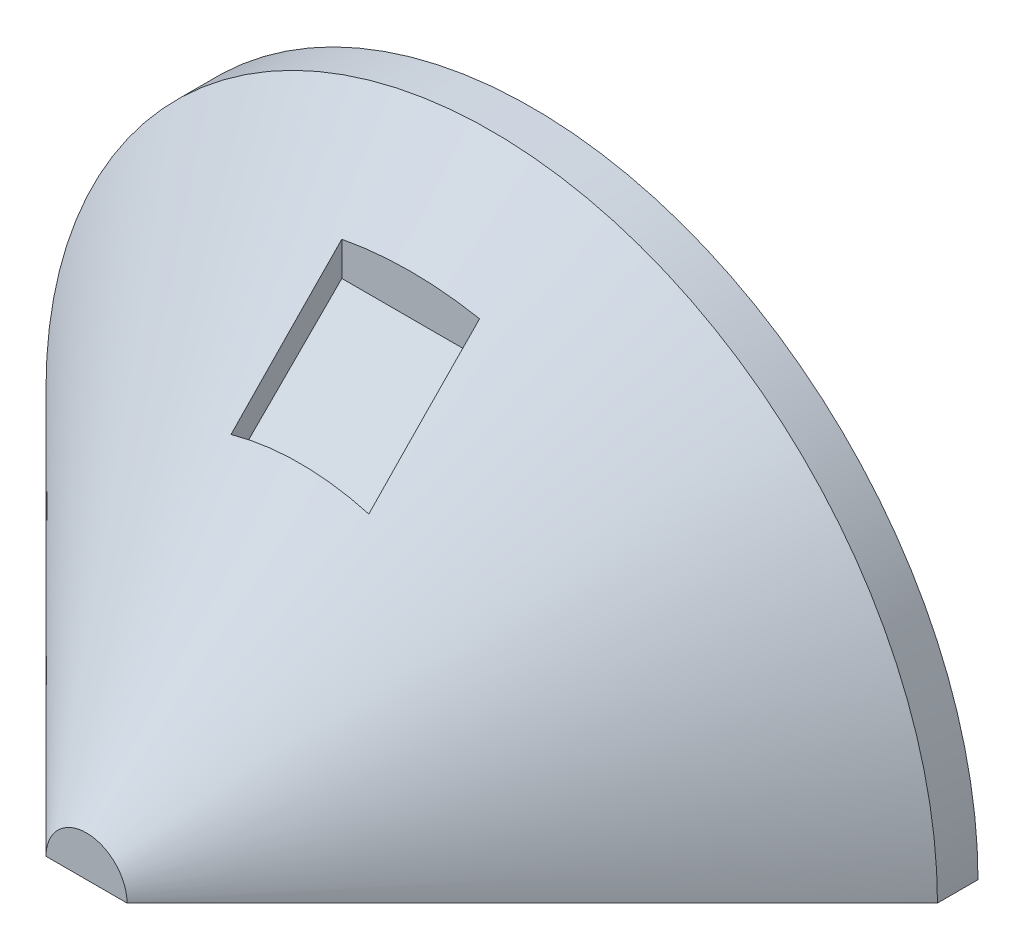
ISO-10303-21;
HEADER;
FILE_DESCRIPTION(('STEP AP214'),'2;1');
FILE_NAME('part.step','',(''),(''),'','','');
FILE_SCHEMA(('AUTOMOTIVE_DESIGN { 1 0 10303 214 1 1 1 1 }'));
ENDSEC;
DATA;
#1=APPLICATION_CONTEXT('core data for automotive mechanical design processes');
#2=APPLICATION_PROTOCOL_DEFINITION('international standard','automotive_design',2000,#1);
#3=PRODUCT_CONTEXT('',#1,'mechanical');
#4=PRODUCT('Part','Part','',(#3));
#5=PRODUCT_RELATED_PRODUCT_CATEGORY('part','',(#4));
#6=PRODUCT_DEFINITION_FORMATION('','',#4);
#7=PRODUCT_DEFINITION_CONTEXT('part definition',#1,'design');
#8=PRODUCT_DEFINITION('design','',#6,#7);
#9=PRODUCT_DEFINITION_SHAPE('','',#8);
#10=(LENGTH_UNIT() NAMED_UNIT(*) SI_UNIT(.MILLI.,.METRE.));
#11=(NAMED_UNIT(*) PLANE_ANGLE_UNIT() SI_UNIT($,.RADIAN.));
#12=(NAMED_UNIT(*) SI_UNIT($,.STERADIAN.) SOLID_ANGLE_UNIT());
#13=UNCERTAINTY_MEASURE_WITH_UNIT(LENGTH_MEASURE(1.E-05),#10,'distance_accuracy_value','');
#14=(GEOMETRIC_REPRESENTATION_CONTEXT(3) GLOBAL_UNCERTAINTY_ASSIGNED_CONTEXT((#13)) GLOBAL_UNIT_ASSIGNED_CONTEXT((#10,
#11,#12)) REPRESENTATION_CONTEXT('',''));
#15=CARTESIAN_POINT('',(0.,0.,0.));
#16=DIRECTION('',(0.,0.,1.));
#17=DIRECTION('',(1.,0.,0.));
#18=AXIS2_PLACEMENT_3D('',#15,#16,#17);
#19=CARTESIAN_POINT('',(0.,0.,0.));
#20=DIRECTION('',(0.,0.,1.));
#21=DIRECTION('',(1.,0.,0.));
#22=AXIS2_PLACEMENT_3D('',#19,#20,#21);
#23=PLANE('',#22);
#24=CARTESIAN_POINT('',(0.,0.,0.));
#25=DIRECTION('',(0.,0.,-1.));
#26=DIRECTION('',(-1.,0.,0.));
#27=AXIS2_PLACEMENT_3D('',#24,#25,#26);
#28=CIRCLE('',#27,3.81);
#29=CARTESIAN_POINT('',(-3.81,0.,0.));
#30=VERTEX_POINT('',#29);
#31=CARTESIAN_POINT('',(3.81,0.,0.));
#32=VERTEX_POINT('',#31);
#33=EDGE_CURVE('E70',#30,#32,#28,.T.);
#34=ORIENTED_EDGE('',*,*,#33,.F.);
#35=DIRECTION('',(1.,0.,0.));
#36=VECTOR('',#35,1.);
#37=CARTESIAN_POINT('',(0.,0.,0.));
#38=LINE('',#37,#36);
#39=EDGE_CURVE('E183',#30,#32,#38,.T.);
#40=ORIENTED_EDGE('',*,*,#39,.T.);
#41=EDGE_LOOP('',(#34,#40));
#42=FACE_BOUND('',#41,.T.);
#43=ADVANCED_FACE('F43',(#42),#23,.T.);
#44=CARTESIAN_POINT('',(0.,0.,-38.1));
#45=DIRECTION('',(0.,0.,-1.));
#46=DIRECTION('',(-1.,0.,0.));
#47=AXIS2_PLACEMENT_3D('',#44,#45,#46);
#48=CONICAL_SURFACE('',#47,41.91,0.785398163397448);
#49=CARTESIAN_POINT('',(6.477,0.842869448779956,-2.72161219820089));
#50=CARTESIAN_POINT('',(6.477,0.956219399993616,-2.73622982980979));
#51=CARTESIAN_POINT('',(6.477,1.06917219501972,-2.75371758379044));
#52=CARTESIAN_POINT('',(6.477,1.29406818146228,-2.79408485449339));
#53=CARTESIAN_POINT('',(6.477,1.40601174164106,-2.81696231149082));
#54=CARTESIAN_POINT('',(6.477,1.73945698590338,-2.89302240928253));
#55=CARTESIAN_POINT('',(6.477,1.95926530560957,-2.9537260118908));
#56=CARTESIAN_POINT('',(6.477,2.39011658919462,-3.09094491616291));
#57=CARTESIAN_POINT('',(6.477,2.60124188698637,-3.16720682383204));
#58=CARTESIAN_POINT('',(6.477,2.91393982876044,-3.29164978414877));
#59=CARTESIAN_POINT('',(6.477,3.01754390060147,-3.33482306888037));
#60=CARTESIAN_POINT('',(6.477,3.22343986921373,-3.42418922035148));
#61=CARTESIAN_POINT('',(6.477,3.325731790095,-3.47038203151352));
#62=CARTESIAN_POINT('',(6.477,3.62809203250162,-3.61179767215281));
#63=CARTESIAN_POINT('',(6.477,3.82633007166669,-3.71094460559741));
#64=CARTESIAN_POINT('',(6.477,4.21833739913427,-3.91775339505249));
#65=CARTESIAN_POINT('',(6.477,4.41210544276604,-4.02541758659637));
#66=CARTESIAN_POINT('',(6.477,4.7958407531647,-4.24773783100251));
#67=CARTESIAN_POINT('',(6.477,4.98580385774823,-4.36240103862235));
#68=CARTESIAN_POINT('',(6.477,5.36219902925257,-4.59732392131671));
#69=CARTESIAN_POINT('',(6.477,5.54863139945488,-4.71758311261388));
#70=CARTESIAN_POINT('',(6.477,5.91911464719325,-4.96314852254677));
#71=CARTESIAN_POINT('',(6.477,6.10315432980602,-5.08847158153622));
#72=CARTESIAN_POINT('',(6.477,6.46856250247429,-5.34295994379753));
#73=CARTESIAN_POINT('',(6.477,6.64993086410265,-5.47212543090337));
#74=CARTESIAN_POINT('',(6.477,7.19035996873437,-5.8642502768921));
#75=CARTESIAN_POINT('',(6.477,7.54595823019096,-6.13198169820763));
#76=CARTESIAN_POINT('',(6.477,8.25922989971028,-6.68352816740761));
#77=CARTESIAN_POINT('',(6.477,8.61671859071855,-6.9675801740641));
#78=CARTESIAN_POINT('',(6.477,9.32605648448804,-7.54269983750977));
#79=CARTESIAN_POINT('',(6.477,9.6779050632271,-7.8337682617965));
#80=CARTESIAN_POINT('',(6.477,10.3763131645805,-8.42043924893455));
#81=CARTESIAN_POINT('',(6.477,10.7228835707738,-8.71602889344435));
#82=CARTESIAN_POINT('',(6.477,11.4125166078571,-9.31123328104519));
#83=CARTESIAN_POINT('',(6.477,11.7555793995797,-9.61084783811346));
#84=CARTESIAN_POINT('',(6.477,12.4297304605082,-10.2051742796611));
#85=CARTESIAN_POINT('',(6.477,12.7608930365156,-10.4998019973915));
#86=CARTESIAN_POINT('',(6.477,13.4210382810889,-11.0914910845659));
#87=CARTESIAN_POINT('',(6.477,13.750020935978,-11.3885524692526));
#88=CARTESIAN_POINT('',(6.477,14.7342970223113,-12.2827126850865));
#89=CARTESIAN_POINT('',(6.477,15.3869006908484,-12.88277171935));
#90=CARTESIAN_POINT('',(6.477,16.6871225335786,-14.0883988575834));
#91=CARTESIAN_POINT('',(6.477,17.3347401316875,-14.6939675810111));
#92=CARTESIAN_POINT('',(6.477,18.6262602205971,-15.9090577091594));
#93=CARTESIAN_POINT('',(6.477,19.2701626910742,-16.5185791354645));
#94=CARTESIAN_POINT('',(6.477,20.5558959972302,-17.7412616804212));
#95=CARTESIAN_POINT('',(6.477,21.1977236416842,-18.3544261515724));
#96=CARTESIAN_POINT('',(6.477,22.4792116770366,-19.5830188474137));
#97=CARTESIAN_POINT('',(6.477,23.1188720604752,-20.1984470798805));
#98=CARTESIAN_POINT('',(6.477,24.3964409812457,-21.4310309819449));
#99=CARTESIAN_POINT('',(6.477,25.0343496355804,-22.0481865303223));
#100=CARTESIAN_POINT('',(6.477,26.3087958082669,-23.2839116346047));
#101=CARTESIAN_POINT('',(6.477,26.9453333261877,-23.9024811909542));
#102=CARTESIAN_POINT('',(6.477,28.8356768546421,-25.7427504309353));
#103=CARTESIAN_POINT('',(6.477,30.0878846268268,-26.9660916895148));
#104=CARTESIAN_POINT('',(6.477,32.5893641796665,-29.4158116724794));
#105=CARTESIAN_POINT('',(6.477,33.8386359105584,-30.642190447634));
#106=CARTESIAN_POINT('',(6.477,36.3345983976939,-33.0966837674544));
#107=CARTESIAN_POINT('',(6.477,37.5812899140691,-34.3247975393266));
#108=CARTESIAN_POINT('',(6.477,40.0730812954313,-36.7826276944647));
#109=CARTESIAN_POINT('',(6.477,41.3181811671586,-38.0123440708989));
#110=CARTESIAN_POINT('',(6.477,43.4405197959329,-40.1105296729186));
#111=CARTESIAN_POINT('',(6.477,44.3180634869518,-40.9786905180742));
#112=CARTESIAN_POINT('',(6.477,46.0727068234096,-42.7155880657633));
#113=CARTESIAN_POINT('',(6.477,46.9498064320186,-43.5843248055021));
#114=CARTESIAN_POINT('',(6.477,48.709286945283,-45.3278887862616));
#115=CARTESIAN_POINT('',(6.477,49.5916650507695,-46.2027188517798));
#116=CARTESIAN_POINT('',(6.477,51.355984011298,-47.9526905904317));
#117=CARTESIAN_POINT('',(6.477,52.2379248936328,-48.8278322360483));
#118=CARTESIAN_POINT('',(6.477,53.1197102062117,-49.70313055122));
#119=B_SPLINE_CURVE_WITH_KNOTS('',3,(#49,#50,#51,#52,#53,#54,#55,#56,#57,#58,#59,#60,#61,#62,
#63,#64,#65,#66,#67,#68,#69,#70,#71,#72,#73,#74,#75,#76,#77,#78,#79,#80,#81,#82,#83,#84,#85,#86,
#87,#88,#89,#90,#91,#92,#93,#94,#95,#96,#97,#98,#99,#100,#101,#102,#103,#104,#105,#106,#107,
#108,#109,#110,#111,#112,#113,#114,#115,#116,#117,#118),.UNSPECIFIED.,.F.,.F.,(4,2,2,2,2,2,2,2,
2,2,2,2,2,2,2,2,2,2,2,2,2,2,2,2,2,2,2,2,2,2,2,2,2,2,4),(0.,0.342784399873119,0.685438013407543,
1.36865860105076,2.0415317290914,2.37820977516884,2.71488162608678,3.37954683577346,
4.04439494055495,4.70993445508402,5.37541653968817,6.04333096360291,6.71127739422145,
8.04639872508365,9.41609352912301,10.7859388445707,12.1524136675977,13.5188255509105,
14.8485731498506,16.1783290837149,18.8379126551078,21.4977990339767,24.1576999499486,
26.8206276996261,29.4835646060336,32.1463190969107,34.8090744247419,40.0608552730791,
45.3127245010225,50.5627252046937,55.8127036010209,59.5159554230186,63.2194758869661,
66.9471115997281,70.6744742820637),.UNSPECIFIED.);
#120=CARTESIAN_POINT('',(6.477,22.9806842152274,-20.066));
#121=VERTEX_POINT('',#120);
#122=CARTESIAN_POINT('',(6.477,33.672727406612,-30.48));
#123=VERTEX_POINT('',#122);
#124=EDGE_CURVE('E11',#121,#123,#119,.T.);
#125=ORIENTED_EDGE('',*,*,#124,.F.);
#126=CARTESIAN_POINT('',(0.,0.,-20.066));
#127=DIRECTION('',(0.,0.,-1.));
#128=DIRECTION('',(-1.,0.,0.));
#129=AXIS2_PLACEMENT_3D('',#126,#127,#128);
#130=CIRCLE('',#129,23.876);
#131=CARTESIAN_POINT('',(-6.477,22.9806842152274,-20.066));
#132=VERTEX_POINT('',#131);
#133=EDGE_CURVE('E205',#121,#132,#130,.F.);
#134=ORIENTED_EDGE('',*,*,#133,.T.);
#135=CARTESIAN_POINT('',(-6.477,0.842869448779956,-2.72161219820089));
#136=CARTESIAN_POINT('',(-6.477,0.956219399993616,-2.73622982980979));
#137=CARTESIAN_POINT('',(-6.477,1.06917219501972,-2.75371758379044));
#138=CARTESIAN_POINT('',(-6.477,1.29406818146228,-2.7940848544934));
#139=CARTESIAN_POINT('',(-6.477,1.40601174164106,-2.81696231149083));
#140=CARTESIAN_POINT('',(-6.477,1.73945698590337,-2.89302240928254));
#141=CARTESIAN_POINT('',(-6.477,1.95926530560957,-2.9537260118908));
#142=CARTESIAN_POINT('',(-6.477,2.39011658919462,-3.09094491616291));
#143=CARTESIAN_POINT('',(-6.477,2.60124188698637,-3.16720682383204));
#144=CARTESIAN_POINT('',(-6.477,2.91393982876043,-3.29164978414878));
#145=CARTESIAN_POINT('',(-6.477,3.01754390060147,-3.33482306888037));
#146=CARTESIAN_POINT('',(-6.477,3.22343986921373,-3.42418922035148));
#147=CARTESIAN_POINT('',(-6.477,3.325731790095,-3.47038203151352));
#148=CARTESIAN_POINT('',(-6.477,3.62809203250162,-3.61179767215281));
#149=CARTESIAN_POINT('',(-6.477,3.82633007166669,-3.71094460559741));
#150=CARTESIAN_POINT('',(-6.477,4.21833739913427,-3.91775339505249));
#151=CARTESIAN_POINT('',(-6.477,4.41210544276604,-4.02541758659637));
#152=CARTESIAN_POINT('',(-6.477,4.79584075316469,-4.24773783100252));
#153=CARTESIAN_POINT('',(-6.477,4.98580385774823,-4.36240103862235));
#154=CARTESIAN_POINT('',(-6.477,5.36219902925257,-4.59732392131671));
#155=CARTESIAN_POINT('',(-6.477,5.54863139945488,-4.71758311261388));
#156=CARTESIAN_POINT('',(-6.477,5.91911464719325,-4.96314852254677));
#157=CARTESIAN_POINT('',(-6.477,6.10315432980602,-5.08847158153622));
#158=CARTESIAN_POINT('',(-6.477,6.46856250247429,-5.34295994379753));
#159=CARTESIAN_POINT('',(-6.477,6.64993086410265,-5.47212543090337));
#160=CARTESIAN_POINT('',(-6.477,7.19035996873437,-5.8642502768921));
#161=CARTESIAN_POINT('',(-6.477,7.54595823019096,-6.13198169820763));
#162=CARTESIAN_POINT('',(-6.477,8.25922989971028,-6.6835281674076));
#163=CARTESIAN_POINT('',(-6.477,8.61671859071855,-6.96758017406409));
#164=CARTESIAN_POINT('',(-6.477,9.32605648448803,-7.54269983750977));
#165=CARTESIAN_POINT('',(-6.477,9.6779050632271,-7.83376826179649));
#166=CARTESIAN_POINT('',(-6.477,10.3763131645805,-8.42043924893455));
#167=CARTESIAN_POINT('',(-6.477,10.7228835707738,-8.71602889344434));
#168=CARTESIAN_POINT('',(-6.477,11.4125166078571,-9.31123328104519));
#169=CARTESIAN_POINT('',(-6.477,11.7555793995797,-9.61084783811346));
#170=CARTESIAN_POINT('',(-6.477,12.4297304605082,-10.2051742796611));
#171=CARTESIAN_POINT('',(-6.477,12.7608930365156,-10.4998019973915));
#172=CARTESIAN_POINT('',(-6.477,13.4210382810889,-11.0914910845659));
#173=CARTESIAN_POINT('',(-6.477,13.750020935978,-11.3885524692526));
#174=CARTESIAN_POINT('',(-6.477,14.7342970223113,-12.2827126850865));
#175=CARTESIAN_POINT('',(-6.477,15.3869006908484,-12.88277171935));
#176=CARTESIAN_POINT('',(-6.477,16.6871225335786,-14.0883988575834));
#177=CARTESIAN_POINT('',(-6.477,17.3347401316875,-14.6939675810111));
#178=CARTESIAN_POINT('',(-6.477,18.6262602205971,-15.9090577091594));
#179=CARTESIAN_POINT('',(-6.477,19.2701626910742,-16.5185791354645));
#180=CARTESIAN_POINT('',(-6.477,20.5558959972302,-17.7412616804212));
#181=CARTESIAN_POINT('',(-6.477,21.1977236416842,-18.3544261515724));
#182=CARTESIAN_POINT('',(-6.477,22.4792116770366,-19.5830188474137));
#183=CARTESIAN_POINT('',(-6.477,23.1188720604752,-20.1984470798805));
#184=CARTESIAN_POINT('',(-6.477,24.3964409812457,-21.4310309819449));
#185=CARTESIAN_POINT('',(-6.477,25.0343496355804,-22.0481865303223));
#186=CARTESIAN_POINT('',(-6.477,26.3087958082669,-23.2839116346047));
#187=CARTESIAN_POINT('',(-6.477,26.9453333261877,-23.9024811909542));
#188=CARTESIAN_POINT('',(-6.477,28.8356768546421,-25.7427504309353));
#189=CARTESIAN_POINT('',(-6.477,30.0878846268268,-26.9660916895148));
#190=CARTESIAN_POINT('',(-6.477,32.5893641796665,-29.4158116724794));
#191=CARTESIAN_POINT('',(-6.477,33.8386359105584,-30.642190447634));
#192=CARTESIAN_POINT('',(-6.477,36.3345983976939,-33.0966837674544));
#193=CARTESIAN_POINT('',(-6.477,37.5812899140691,-34.3247975393266));
#194=CARTESIAN_POINT('',(-6.477,40.0730812954313,-36.7826276944647));
#195=CARTESIAN_POINT('',(-6.477,41.3181811671586,-38.0123440708989));
#196=CARTESIAN_POINT('',(-6.477,43.4405197959329,-40.1105296729186));
#197=CARTESIAN_POINT('',(-6.477,44.3180634869518,-40.9786905180742));
#198=CARTESIAN_POINT('',(-6.477,46.0727068234096,-42.7155880657633));
#199=CARTESIAN_POINT('',(-6.477,46.9498064320186,-43.5843248055021));
#200=CARTESIAN_POINT('',(-6.477,48.709286945283,-45.3278887862616));
#201=CARTESIAN_POINT('',(-6.477,49.5916650507695,-46.2027188517798));
#202=CARTESIAN_POINT('',(-6.477,51.355984011298,-47.9526905904317));
#203=CARTESIAN_POINT('',(-6.477,52.2379248936328,-48.8278322360483));
#204=CARTESIAN_POINT('',(-6.477,53.1197102062117,-49.70313055122));
#205=B_SPLINE_CURVE_WITH_KNOTS('',3,(#135,#136,#137,#138,#139,#140,#141,#142,#143,#144,#145,
#146,#147,#148,#149,#150,#151,#152,#153,#154,#155,#156,#157,#158,#159,#160,#161,#162,#163,#164,
#165,#166,#167,#168,#169,#170,#171,#172,#173,#174,#175,#176,#177,#178,#179,#180,#181,#182,#183,
#184,#185,#186,#187,#188,#189,#190,#191,#192,#193,#194,#195,#196,#197,#198,#199,#200,#201,#202,
#203,#204),.UNSPECIFIED.,.F.,.F.,(4,2,2,2,2,2,2,2,2,2,2,2,2,2,2,2,2,2,2,2,2,2,2,2,2,2,2,2,2,2,2,
2,2,2,4),(0.,0.342784399873118,0.685438013407543,1.36865860105076,2.0415317290914,
2.37820977516884,2.71488162608678,3.37954683577346,4.04439494055494,4.70993445508402,
5.37541653968817,6.0433309636029,6.71127739422145,8.04639872508365,9.416093529123,
10.7859388445707,12.1524136675977,13.5188255509105,14.8485731498506,16.1783290837149,
18.8379126551078,21.4977990339767,24.1576999499486,26.8206276996261,29.4835646060336,
32.1463190969107,34.8090744247419,40.0608552730791,45.3127245010225,50.5627252046937,
55.8127036010209,59.5159554230186,63.2194758869661,66.9471115997281,70.6744742820637),.UNSPECIFIED.);
#206=CARTESIAN_POINT('',(-6.477,33.672727406612,-30.48));
#207=VERTEX_POINT('',#206);
#208=EDGE_CURVE('E197',#132,#207,#205,.T.);
#209=ORIENTED_EDGE('',*,*,#208,.T.);
#210=CARTESIAN_POINT('',(0.,0.,-30.48));
#211=DIRECTION('',(0.,0.,1.));
#212=DIRECTION('',(1.,0.,0.));
#213=AXIS2_PLACEMENT_3D('',#210,#211,#212);
#214=CIRCLE('',#213,34.29);
#215=EDGE_CURVE('E56',#207,#123,#214,.F.);
#216=ORIENTED_EDGE('',*,*,#215,.T.);
#217=EDGE_LOOP('',(#125,#134,#209,#216));
#218=FACE_BOUND('',#217,.T.);
#219=CARTESIAN_POINT('',(0.,0.,-38.1));
#220=DIRECTION('',(0.,0.,-1.));
#221=DIRECTION('',(-1.,0.,0.));
#222=AXIS2_PLACEMENT_3D('',#219,#220,#221);
#223=CIRCLE('',#222,41.91);
#224=CARTESIAN_POINT('',(-41.91,-1.46327982910916E-13,-38.1));
#225=VERTEX_POINT('',#224);
#226=CARTESIAN_POINT('',(41.91,-1.46327982910916E-13,-38.1));
#227=VERTEX_POINT('',#226);
#228=EDGE_CURVE('E192',#225,#227,#223,.T.);
#229=ORIENTED_EDGE('',*,*,#228,.F.);
#230=DIRECTION('',(0.707106781186547,0.,0.707106781186547));
#231=VECTOR('',#230,1.);
#232=CARTESIAN_POINT('',(-41.91,-1.46327982910916E-13,-38.1));
#233=LINE('',#232,#231);
#234=EDGE_CURVE('E180',#225,#30,#233,.T.);
#235=ORIENTED_EDGE('',*,*,#234,.T.);
#236=ORIENTED_EDGE('',*,*,#33,.T.);
#237=DIRECTION('',(-0.707106781186547,0.,0.707106781186547));
#238=VECTOR('',#237,1.);
#239=CARTESIAN_POINT('',(41.91,-1.46327982910916E-13,-38.1));
#240=LINE('',#239,#238);
#241=EDGE_CURVE('E164',#227,#32,#240,.T.);
#242=ORIENTED_EDGE('',*,*,#241,.F.);
#243=EDGE_LOOP('',(#229,#235,#236,#242));
#244=FACE_BOUND('',#243,.T.);
#245=ADVANCED_FACE('F206',(#218,#244),#48,.T.);
#246=CARTESIAN_POINT('',(0.,0.,-3.81));
#247=DIRECTION('',(0.,0.,-1.));
#248=DIRECTION('',(-1.,0.,0.));
#249=AXIS2_PLACEMENT_3D('',#246,#247,#248);
#250=CYLINDRICAL_SURFACE('',#249,41.91);
#251=CARTESIAN_POINT('',(0.,0.,-41.91));
#252=DIRECTION('',(0.,0.,-1.));
#253=DIRECTION('',(-1.,0.,0.));
#254=AXIS2_PLACEMENT_3D('',#251,#252,#253);
#255=CIRCLE('',#254,41.91);
#256=CARTESIAN_POINT('',(-41.91,-1.46327982910916E-13,-41.91));
#257=VERTEX_POINT('',#256);
#258=CARTESIAN_POINT('',(41.91,-1.46327982910916E-13,-41.91));
#259=VERTEX_POINT('',#258);
#260=EDGE_CURVE('E189',#257,#259,#255,.T.);
#261=ORIENTED_EDGE('',*,*,#260,.F.);
#262=DIRECTION('',(0.,0.,1.));
#263=VECTOR('',#262,1.);
#264=CARTESIAN_POINT('',(-41.91,-1.46327982910916E-13,-38.1));
#265=LINE('',#264,#263);
#266=EDGE_CURVE('E176',#257,#225,#265,.T.);
#267=ORIENTED_EDGE('',*,*,#266,.T.);
#268=ORIENTED_EDGE('',*,*,#228,.T.);
#269=DIRECTION('',(0.,0.,1.));
#270=VECTOR('',#269,1.);
#271=CARTESIAN_POINT('',(41.91,-1.46327982910916E-13,-38.1));
#272=LINE('',#271,#270);
#273=EDGE_CURVE('E160',#259,#227,#272,.T.);
#274=ORIENTED_EDGE('',*,*,#273,.F.);
#275=EDGE_LOOP('',(#261,#267,#268,#274));
#276=FACE_BOUND('',#275,.T.);
#277=ADVANCED_FACE('F234',(#276),#250,.T.);
#278=CARTESIAN_POINT('',(-41.91,-1.46327982910916E-13,-41.91));
#279=DIRECTION('',(0.,0.,-1.));
#280=DIRECTION('',(-1.,0.,0.));
#281=AXIS2_PLACEMENT_3D('',#278,#279,#280);
#282=PLANE('',#281);
#283=CARTESIAN_POINT('',(0.,0.,-41.91));
#284=DIRECTION('',(0.,0.,-1.));
#285=DIRECTION('',(-1.,0.,0.));
#286=AXIS2_PLACEMENT_3D('',#283,#284,#285);
#287=CIRCLE('',#286,38.1);
#288=CARTESIAN_POINT('',(-38.1,-1.33025439009923E-13,-41.91));
#289=VERTEX_POINT('',#288);
#290=CARTESIAN_POINT('',(38.1,-1.33025439009923E-13,-41.91));
#291=VERTEX_POINT('',#290);
#292=EDGE_CURVE('E186',#289,#291,#287,.T.);
#293=ORIENTED_EDGE('',*,*,#292,.F.);
#294=DIRECTION('',(-1.,0.,0.));
#295=VECTOR('',#294,1.);
#296=CARTESIAN_POINT('',(-41.91,-1.46327982910916E-13,-41.91));
#297=LINE('',#296,#295);
#298=EDGE_CURVE('E172',#289,#257,#297,.T.);
#299=ORIENTED_EDGE('',*,*,#298,.T.);
#300=ORIENTED_EDGE('',*,*,#260,.T.);
#301=DIRECTION('',(1.,0.,0.));
#302=VECTOR('',#301,1.);
#303=CARTESIAN_POINT('',(41.91,-1.46327982910916E-13,-41.91));
#304=LINE('',#303,#302);
#305=EDGE_CURVE('E156',#291,#259,#304,.T.);
#306=ORIENTED_EDGE('',*,*,#305,.F.);
#307=EDGE_LOOP('',(#293,#299,#300,#306));
#308=FACE_BOUND('',#307,.T.);
#309=ADVANCED_FACE('F231',(#308),#282,.T.);
#310=CARTESIAN_POINT('',(0.,0.,-3.81));
#311=DIRECTION('',(0.,0.,-1.));
#312=DIRECTION('',(-1.,0.,0.));
#313=AXIS2_PLACEMENT_3D('',#310,#311,#312);
#314=CONICAL_SURFACE('',#313,0.,0.785398163397448);
#315=DIRECTION('',(-0.707106781186547,0.,-0.707106781186547));
#316=VECTOR('',#315,1.);
#317=CARTESIAN_POINT('',(-38.1,-1.33025439009923E-13,-41.91));
#318=LINE('',#317,#316);
#319=CARTESIAN_POINT('',(0.,0.,-3.81));
#320=VERTEX_POINT('',#319);
#321=EDGE_CURVE('E168',#320,#289,#318,.T.);
#322=ORIENTED_EDGE('',*,*,#321,.T.);
#323=ORIENTED_EDGE('',*,*,#292,.T.);
#324=DIRECTION('',(0.707106781186547,0.,-0.707106781186547));
#325=VECTOR('',#324,1.);
#326=CARTESIAN_POINT('',(38.1,-1.33025439009923E-13,-41.91));
#327=LINE('',#326,#325);
#328=EDGE_CURVE('E126',#320,#291,#327,.T.);
#329=ORIENTED_EDGE('',*,*,#328,.F.);
#330=EDGE_LOOP('',(#322,#323,#329));
#331=FACE_BOUND('',#330,.T.);
#332=ADVANCED_FACE('F227',(#331),#314,.F.);
#333=CARTESIAN_POINT('',(0.,0.,0.));
#334=DIRECTION('',(0.,-1.,0.));
#335=DIRECTION('',(0.,0.,1.));
#336=AXIS2_PLACEMENT_3D('',#333,#334,#335);
#337=PLANE('',#336);
#338=ORIENTED_EDGE('',*,*,#321,.F.);
#339=ORIENTED_EDGE('',*,*,#328,.T.);
#340=ORIENTED_EDGE('',*,*,#305,.T.);
#341=ORIENTED_EDGE('',*,*,#273,.T.);
#342=ORIENTED_EDGE('',*,*,#241,.T.);
#343=ORIENTED_EDGE('',*,*,#39,.F.);
#344=ORIENTED_EDGE('',*,*,#234,.F.);
#345=ORIENTED_EDGE('',*,*,#266,.F.);
#346=ORIENTED_EDGE('',*,*,#298,.F.);
#347=EDGE_LOOP('',(#338,#339,#340,#341,#342,#343,#344,#345,#346));
#348=FACE_BOUND('',#347,.T.);
#349=ADVANCED_FACE('F224',(#348),#337,.T.);
#350=CARTESIAN_POINT('',(6.477,20.0659999999999,-20.066));
#351=DIRECTION('',(0.,0.707106781186548,0.707106781186547));
#352=DIRECTION('',(0.,-0.707106781186547,0.707106781186548));
#353=AXIS2_PLACEMENT_3D('',#350,#351,#352);
#354=PLANE('',#353);
#355=DIRECTION('',(-1.,0.,0.));
#356=VECTOR('',#355,1.);
#357=CARTESIAN_POINT('',(6.477,20.0659999999999,-20.066));
#358=LINE('',#357,#356);
#359=CARTESIAN_POINT('',(6.477,20.0659999999999,-20.066));
#360=VERTEX_POINT('',#359);
#361=CARTESIAN_POINT('',(-6.477,20.0659999999999,-20.066));
#362=VERTEX_POINT('',#361);
#363=EDGE_CURVE('E127',#360,#362,#358,.T.);
#364=ORIENTED_EDGE('',*,*,#363,.F.);
#365=DIRECTION('',(0.,0.707106781186547,-0.707106781186548));
#366=VECTOR('',#365,1.);
#367=CARTESIAN_POINT('',(6.477,20.0659999999999,-20.066));
#368=LINE('',#367,#366);
#369=CARTESIAN_POINT('',(6.477,30.4799999999999,-30.48));
#370=VERTEX_POINT('',#369);
#371=EDGE_CURVE('E122',#360,#370,#368,.T.);
#372=ORIENTED_EDGE('',*,*,#371,.T.);
#373=DIRECTION('',(-1.,0.,0.));
#374=VECTOR('',#373,1.);
#375=CARTESIAN_POINT('',(6.477,30.4799999999999,-30.48));
#376=LINE('',#375,#374);
#377=CARTESIAN_POINT('',(-6.477,30.4799999999999,-30.48));
#378=VERTEX_POINT('',#377);
#379=EDGE_CURVE('E117',#370,#378,#376,.T.);
#380=ORIENTED_EDGE('',*,*,#379,.T.);
#381=DIRECTION('',(0.,0.707106781186547,-0.707106781186548));
#382=VECTOR('',#381,1.);
#383=CARTESIAN_POINT('',(-6.477,20.0659999999999,-20.066));
#384=LINE('',#383,#382);
#385=EDGE_CURVE('E120',#362,#378,#384,.T.);
#386=ORIENTED_EDGE('',*,*,#385,.F.);
#387=EDGE_LOOP('',(#364,#372,#380,#386));
#388=FACE_BOUND('',#387,.T.);
#389=ADVANCED_FACE('F119',(#388),#354,.T.);
#390=CARTESIAN_POINT('',(6.477,30.4799999999999,-30.48));
#391=DIRECTION('',(0.,0.,1.));
#392=DIRECTION('',(1.,0.,0.));
#393=AXIS2_PLACEMENT_3D('',#390,#391,#392);
#394=PLANE('',#393);
#395=DIRECTION('',(0.,1.,0.));
#396=VECTOR('',#395,1.);
#397=CARTESIAN_POINT('',(-6.477,30.4799999999999,-30.48));
#398=LINE('',#397,#396);
#399=EDGE_CURVE('E63',#378,#207,#398,.T.);
#400=ORIENTED_EDGE('',*,*,#399,.F.);
#401=ORIENTED_EDGE('',*,*,#379,.F.);
#402=DIRECTION('',(0.,1.,0.));
#403=VECTOR('',#402,1.);
#404=CARTESIAN_POINT('',(6.477,30.4799999999999,-30.48));
#405=LINE('',#404,#403);
#406=EDGE_CURVE('E145',#370,#123,#405,.T.);
#407=ORIENTED_EDGE('',*,*,#406,.T.);
#408=ORIENTED_EDGE('',*,*,#215,.F.);
#409=EDGE_LOOP('',(#400,#401,#407,#408));
#410=FACE_BOUND('',#409,.T.);
#411=ADVANCED_FACE('F129',(#410),#394,.T.);
#412=CARTESIAN_POINT('',(6.477,20.0659999999999,-20.066));
#413=DIRECTION('',(0.,0.,-1.));
#414=DIRECTION('',(-1.,0.,0.));
#415=AXIS2_PLACEMENT_3D('',#412,#413,#414);
#416=PLANE('',#415);
#417=DIRECTION('',(0.,-1.,0.));
#418=VECTOR('',#417,1.);
#419=CARTESIAN_POINT('',(6.477,29.3189487757862,-20.066));
#420=LINE('',#419,#418);
#421=EDGE_CURVE('E148',#121,#360,#420,.T.);
#422=ORIENTED_EDGE('',*,*,#421,.T.);
#423=ORIENTED_EDGE('',*,*,#363,.T.);
#424=DIRECTION('',(0.,-1.,0.));
#425=VECTOR('',#424,1.);
#426=CARTESIAN_POINT('',(-6.477,29.3189487757862,-20.066));
#427=LINE('',#426,#425);
#428=EDGE_CURVE('E133',#132,#362,#427,.T.);
#429=ORIENTED_EDGE('',*,*,#428,.F.);
#430=ORIENTED_EDGE('',*,*,#133,.F.);
#431=EDGE_LOOP('',(#422,#423,#429,#430));
#432=FACE_BOUND('',#431,.T.);
#433=ADVANCED_FACE('F215',(#432),#416,.T.);
#434=CARTESIAN_POINT('',(6.477,0.,0.));
#435=DIRECTION('',(1.,0.,0.));
#436=DIRECTION('',(0.,0.,-1.));
#437=AXIS2_PLACEMENT_3D('',#434,#435,#436);
#438=PLANE('',#437);
#439=ORIENTED_EDGE('',*,*,#124,.T.);
#440=ORIENTED_EDGE('',*,*,#406,.F.);
#441=ORIENTED_EDGE('',*,*,#371,.F.);
#442=ORIENTED_EDGE('',*,*,#421,.F.);
#443=EDGE_LOOP('',(#439,#440,#441,#442));
#444=FACE_BOUND('',#443,.T.);
#445=ADVANCED_FACE('F211',(#444),#438,.F.);
#446=CARTESIAN_POINT('',(-6.477,0.,0.));
#447=DIRECTION('',(1.,0.,0.));
#448=DIRECTION('',(0.,0.,-1.));
#449=AXIS2_PLACEMENT_3D('',#446,#447,#448);
#450=PLANE('',#449);
#451=ORIENTED_EDGE('',*,*,#428,.T.);
#452=ORIENTED_EDGE('',*,*,#385,.T.);
#453=ORIENTED_EDGE('',*,*,#399,.T.);
#454=ORIENTED_EDGE('',*,*,#208,.F.);
#455=EDGE_LOOP('',(#451,#452,#453,#454));
#456=FACE_BOUND('',#455,.T.);
#457=ADVANCED_FACE('F135',(#456),#450,.T.);
#458=CLOSED_SHELL('',(#43,#245,#277,#309,#332,#349,#389,#411,#433,#445,#457));
#459=MANIFOLD_SOLID_BREP('B2',#458);
#460=ADVANCED_BREP_SHAPE_REPRESENTATION('',(#18,#459),#14);
#461=SHAPE_DEFINITION_REPRESENTATION(#9,#460);
ENDSEC;
END-ISO-10303-21;
